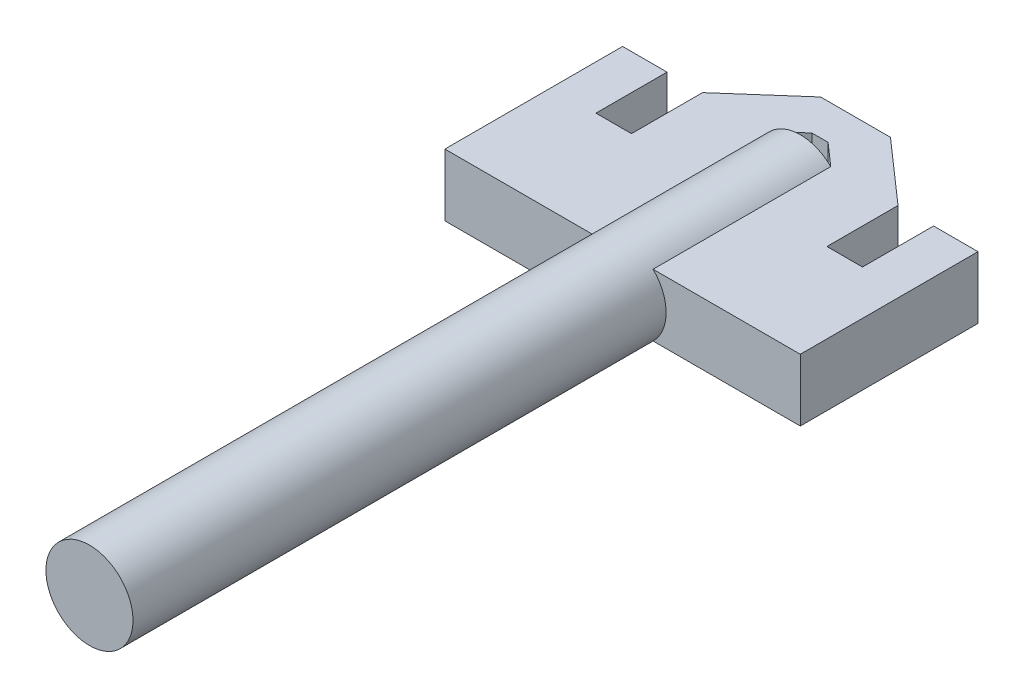
ISO-10303-21;
HEADER;
FILE_DESCRIPTION(('STEP AP214'),'2;1');
FILE_NAME('part.step','',(''),(''),'','','');
FILE_SCHEMA(('AUTOMOTIVE_DESIGN { 1 0 10303 214 1 1 1 1 }'));
ENDSEC;
DATA;
#1=APPLICATION_CONTEXT('core data for automotive mechanical design processes');
#2=APPLICATION_PROTOCOL_DEFINITION('international standard','automotive_design',2000,#1);
#3=PRODUCT_CONTEXT('',#1,'mechanical');
#4=PRODUCT('Part','Part','',(#3));
#5=PRODUCT_RELATED_PRODUCT_CATEGORY('part','',(#4));
#6=PRODUCT_DEFINITION_FORMATION('','',#4);
#7=PRODUCT_DEFINITION_CONTEXT('part definition',#1,'design');
#8=PRODUCT_DEFINITION('design','',#6,#7);
#9=PRODUCT_DEFINITION_SHAPE('','',#8);
#10=(LENGTH_UNIT() NAMED_UNIT(*) SI_UNIT(.MILLI.,.METRE.));
#11=(NAMED_UNIT(*) PLANE_ANGLE_UNIT() SI_UNIT($,.RADIAN.));
#12=(NAMED_UNIT(*) SI_UNIT($,.STERADIAN.) SOLID_ANGLE_UNIT());
#13=UNCERTAINTY_MEASURE_WITH_UNIT(LENGTH_MEASURE(1.E-05),#10,'distance_accuracy_value','');
#14=(GEOMETRIC_REPRESENTATION_CONTEXT(3) GLOBAL_UNCERTAINTY_ASSIGNED_CONTEXT((#13)) GLOBAL_UNIT_ASSIGNED_CONTEXT((#10,
#11,#12)) REPRESENTATION_CONTEXT('',''));
#15=CARTESIAN_POINT('',(0.,0.,0.));
#16=DIRECTION('',(0.,0.,1.));
#17=DIRECTION('',(1.,0.,0.));
#18=AXIS2_PLACEMENT_3D('',#15,#16,#17);
#19=CARTESIAN_POINT('',(0.,0.,0.));
#20=DIRECTION('',(0.,0.,1.));
#21=DIRECTION('',(1.,0.,0.));
#22=AXIS2_PLACEMENT_3D('',#19,#20,#21);
#23=PLANE('',#22);
#24=DIRECTION('',(0.,-1.,0.));
#25=VECTOR('',#24,1.);
#26=CARTESIAN_POINT('',(-1.71464281994822,13.1809856193247,0.));
#27=LINE('',#26,#25);
#28=CARTESIAN_POINT('',(-1.71464281994822,1.75,0.));
#29=VERTEX_POINT('',#28);
#30=CARTESIAN_POINT('',(-1.71464281994822,-1.75,0.));
#31=VERTEX_POINT('',#30);
#32=EDGE_CURVE('E197',#29,#31,#27,.T.);
#33=ORIENTED_EDGE('',*,*,#32,.F.);
#34=CARTESIAN_POINT('',(0.,0.,0.));
#35=DIRECTION('',(0.,0.,1.));
#36=DIRECTION('',(1.,0.,0.));
#37=AXIS2_PLACEMENT_3D('',#34,#35,#36);
#38=CIRCLE('',#37,2.45);
#39=CARTESIAN_POINT('',(1.71464281994822,1.75,0.));
#40=VERTEX_POINT('',#39);
#41=EDGE_CURVE('E400',#40,#29,#38,.T.);
#42=ORIENTED_EDGE('',*,*,#41,.F.);
#43=DIRECTION('',(0.,-1.,0.));
#44=VECTOR('',#43,1.);
#45=CARTESIAN_POINT('',(1.71464281994822,13.1809856193247,0.));
#46=LINE('',#45,#44);
#47=CARTESIAN_POINT('',(1.71464281994822,-1.75,0.));
#48=VERTEX_POINT('',#47);
#49=EDGE_CURVE('E256',#40,#48,#46,.T.);
#50=ORIENTED_EDGE('',*,*,#49,.T.);
#51=EDGE_CURVE('E396',#31,#48,#38,.T.);
#52=ORIENTED_EDGE('',*,*,#51,.F.);
#53=EDGE_LOOP('',(#33,#42,#50,#52));
#54=FACE_BOUND('',#53,.T.);
#55=ADVANCED_FACE('F45',(#54),#23,.F.);
#56=DIRECTION('',(1.,0.,0.));
#57=VECTOR('',#56,1.);
#58=CARTESIAN_POINT('',(10.,1.75,0.));
#59=LINE('',#58,#57);
#60=CARTESIAN_POINT('',(-10.,1.75,0.));
#61=VERTEX_POINT('',#60);
#62=CARTESIAN_POINT('',(-7.5,1.75,0.));
#63=VERTEX_POINT('',#62);
#64=EDGE_CURVE('E338',#61,#63,#59,.T.);
#65=ORIENTED_EDGE('',*,*,#64,.T.);
#66=DIRECTION('',(0.,1.,0.));
#67=VECTOR('',#66,1.);
#68=CARTESIAN_POINT('',(-7.5,1.75,0.));
#69=LINE('',#68,#67);
#70=CARTESIAN_POINT('',(-7.5,-1.75,0.));
#71=VERTEX_POINT('',#70);
#72=EDGE_CURVE('E283',#71,#63,#69,.T.);
#73=ORIENTED_EDGE('',*,*,#72,.F.);
#74=DIRECTION('',(-1.,0.,0.));
#75=VECTOR('',#74,1.);
#76=CARTESIAN_POINT('',(10.,-1.75,0.));
#77=LINE('',#76,#75);
#78=CARTESIAN_POINT('',(-10.,-1.75,0.));
#79=VERTEX_POINT('',#78);
#80=EDGE_CURVE('E356',#71,#79,#77,.T.);
#81=ORIENTED_EDGE('',*,*,#80,.T.);
#82=DIRECTION('',(0.,1.,0.));
#83=VECTOR('',#82,1.);
#84=CARTESIAN_POINT('',(-10.,1.75,0.));
#85=LINE('',#84,#83);
#86=EDGE_CURVE('E361',#79,#61,#85,.T.);
#87=ORIENTED_EDGE('',*,*,#86,.T.);
#88=EDGE_LOOP('',(#65,#73,#81,#87));
#89=FACE_BOUND('',#88,.T.);
#90=ADVANCED_FACE('F432',(#89),#23,.F.);
#91=CARTESIAN_POINT('',(0.,0.,40.));
#92=DIRECTION('',(0.,0.,-1.));
#93=DIRECTION('',(-1.,0.,0.));
#94=AXIS2_PLACEMENT_3D('',#91,#92,#93);
#95=CYLINDRICAL_SURFACE('',#94,2.45);
#96=CARTESIAN_POINT('',(0.,0.,10.));
#97=DIRECTION('',(0.,0.,-1.));
#98=DIRECTION('',(-1.,0.,0.));
#99=AXIS2_PLACEMENT_3D('',#96,#97,#98);
#100=CIRCLE('',#99,2.45);
#101=CARTESIAN_POINT('',(1.71464281994822,1.75,10.));
#102=VERTEX_POINT('',#101);
#103=CARTESIAN_POINT('',(1.71464281994822,-1.75,10.));
#104=VERTEX_POINT('',#103);
#105=EDGE_CURVE('E11',#102,#104,#100,.T.);
#106=ORIENTED_EDGE('',*,*,#105,.F.);
#107=DIRECTION('',(0.,0.,-1.));
#108=VECTOR('',#107,1.);
#109=CARTESIAN_POINT('',(1.71464281994822,1.75,40.));
#110=LINE('',#109,#108);
#111=EDGE_CURVE('E392',#102,#40,#110,.T.);
#112=ORIENTED_EDGE('',*,*,#111,.T.);
#113=ORIENTED_EDGE('',*,*,#41,.T.);
#114=DIRECTION('',(0.,0.,-1.));
#115=VECTOR('',#114,1.);
#116=CARTESIAN_POINT('',(-1.71464281994822,1.75,40.));
#117=LINE('',#116,#115);
#118=CARTESIAN_POINT('',(-1.71464281994822,1.75,10.));
#119=VERTEX_POINT('',#118);
#120=EDGE_CURVE('E389',#29,#119,#117,.F.);
#121=ORIENTED_EDGE('',*,*,#120,.T.);
#122=CARTESIAN_POINT('',(-1.71464281994822,-1.75,10.));
#123=VERTEX_POINT('',#122);
#124=EDGE_CURVE('E49',#123,#119,#100,.T.);
#125=ORIENTED_EDGE('',*,*,#124,.F.);
#126=DIRECTION('',(0.,0.,-1.));
#127=VECTOR('',#126,1.);
#128=CARTESIAN_POINT('',(-1.71464281994822,-1.75,40.));
#129=LINE('',#128,#127);
#130=EDGE_CURVE('E385',#123,#31,#129,.T.);
#131=ORIENTED_EDGE('',*,*,#130,.T.);
#132=ORIENTED_EDGE('',*,*,#51,.T.);
#133=DIRECTION('',(0.,0.,-1.));
#134=VECTOR('',#133,1.);
#135=CARTESIAN_POINT('',(1.71464281994822,-1.75,40.));
#136=LINE('',#135,#134);
#137=EDGE_CURVE('E373',#48,#104,#136,.F.);
#138=ORIENTED_EDGE('',*,*,#137,.T.);
#139=EDGE_LOOP('',(#106,#112,#113,#121,#125,#131,#132,#138));
#140=FACE_BOUND('',#139,.T.);
#141=CARTESIAN_POINT('',(0.,0.,40.));
#142=DIRECTION('',(0.,0.,1.));
#143=DIRECTION('',(1.,0.,0.));
#144=AXIS2_PLACEMENT_3D('',#141,#142,#143);
#145=CIRCLE('',#144,2.45);
#146=CARTESIAN_POINT('',(2.45,0.,40.));
#147=VERTEX_POINT('',#146);
#148=EDGE_CURVE('E397',#147,#147,#145,.T.);
#149=ORIENTED_EDGE('',*,*,#148,.F.);
#150=EDGE_LOOP('',(#149));
#151=FACE_BOUND('',#150,.T.);
#152=ADVANCED_FACE('F47',(#140,#151),#95,.T.);
#153=CARTESIAN_POINT('',(0.,0.,40.));
#154=DIRECTION('',(0.,0.,1.));
#155=DIRECTION('',(1.,0.,0.));
#156=AXIS2_PLACEMENT_3D('',#153,#154,#155);
#157=PLANE('',#156);
#158=ORIENTED_EDGE('',*,*,#148,.T.);
#159=EDGE_LOOP('',(#158));
#160=FACE_BOUND('',#159,.T.);
#161=ADVANCED_FACE('F485',(#160),#157,.T.);
#162=CARTESIAN_POINT('',(10.,-1.75,0.));
#163=VERTEX_POINT('',#162);
#164=CARTESIAN_POINT('',(7.5,-1.75,0.));
#165=VERTEX_POINT('',#164);
#166=EDGE_CURVE('E357',#163,#165,#77,.T.);
#167=ORIENTED_EDGE('',*,*,#166,.T.);
#168=DIRECTION('',(0.,-1.,0.));
#169=VECTOR('',#168,1.);
#170=CARTESIAN_POINT('',(7.5,1.75,0.));
#171=LINE('',#170,#169);
#172=CARTESIAN_POINT('',(7.5,1.75,0.));
#173=VERTEX_POINT('',#172);
#174=EDGE_CURVE('E270',#173,#165,#171,.T.);
#175=ORIENTED_EDGE('',*,*,#174,.F.);
#176=CARTESIAN_POINT('',(10.,1.75,0.));
#177=VERTEX_POINT('',#176);
#178=EDGE_CURVE('E365',#173,#177,#59,.T.);
#179=ORIENTED_EDGE('',*,*,#178,.T.);
#180=DIRECTION('',(0.,-1.,0.));
#181=VECTOR('',#180,1.);
#182=CARTESIAN_POINT('',(10.,1.75,0.));
#183=LINE('',#182,#181);
#184=EDGE_CURVE('E290',#177,#163,#183,.T.);
#185=ORIENTED_EDGE('',*,*,#184,.T.);
#186=EDGE_LOOP('',(#167,#175,#179,#185));
#187=FACE_BOUND('',#186,.T.);
#188=ADVANCED_FACE('F469',(#187),#23,.F.);
#189=CARTESIAN_POINT('',(-10.,1.75,10.));
#190=DIRECTION('',(-1.,0.,0.));
#191=DIRECTION('',(0.,0.,1.));
#192=AXIS2_PLACEMENT_3D('',#189,#190,#191);
#193=PLANE('',#192);
#194=ORIENTED_EDGE('',*,*,#86,.F.);
#195=DIRECTION('',(0.,0.,-1.));
#196=VECTOR('',#195,1.);
#197=CARTESIAN_POINT('',(-10.,-1.75,10.));
#198=LINE('',#197,#196);
#199=CARTESIAN_POINT('',(-10.,-1.75,10.));
#200=VERTEX_POINT('',#199);
#201=EDGE_CURVE('E377',#200,#79,#198,.T.);
#202=ORIENTED_EDGE('',*,*,#201,.F.);
#203=DIRECTION('',(0.,1.,0.));
#204=VECTOR('',#203,1.);
#205=CARTESIAN_POINT('',(-10.,1.75,10.));
#206=LINE('',#205,#204);
#207=CARTESIAN_POINT('',(-10.,1.75,10.));
#208=VERTEX_POINT('',#207);
#209=EDGE_CURVE('E343',#200,#208,#206,.T.);
#210=ORIENTED_EDGE('',*,*,#209,.T.);
#211=DIRECTION('',(0.,0.,-1.));
#212=VECTOR('',#211,1.);
#213=CARTESIAN_POINT('',(-10.,1.75,10.));
#214=LINE('',#213,#212);
#215=EDGE_CURVE('E374',#208,#61,#214,.T.);
#216=ORIENTED_EDGE('',*,*,#215,.T.);
#217=EDGE_LOOP('',(#194,#202,#210,#216));
#218=FACE_BOUND('',#217,.T.);
#219=ADVANCED_FACE('F439',(#218),#193,.T.);
#220=CARTESIAN_POINT('',(0.,0.,10.));
#221=DIRECTION('',(0.,0.,-1.));
#222=DIRECTION('',(-1.,0.,0.));
#223=AXIS2_PLACEMENT_3D('',#220,#221,#222);
#224=PLANE('',#223);
#225=DIRECTION('',(-1.,0.,0.));
#226=VECTOR('',#225,1.);
#227=CARTESIAN_POINT('',(10.,-1.75,10.));
#228=LINE('',#227,#226);
#229=EDGE_CURVE('E337',#123,#200,#228,.T.);
#230=ORIENTED_EDGE('',*,*,#229,.F.);
#231=ORIENTED_EDGE('',*,*,#124,.T.);
#232=DIRECTION('',(1.,0.,0.));
#233=VECTOR('',#232,1.);
#234=CARTESIAN_POINT('',(10.,1.75,10.));
#235=LINE('',#234,#233);
#236=EDGE_CURVE('E348',#208,#119,#235,.T.);
#237=ORIENTED_EDGE('',*,*,#236,.F.);
#238=ORIENTED_EDGE('',*,*,#209,.F.);
#239=EDGE_LOOP('',(#230,#231,#237,#238));
#240=FACE_BOUND('',#239,.T.);
#241=ADVANCED_FACE('F490',(#240),#224,.F.);
#242=CARTESIAN_POINT('',(10.,-1.75,10.));
#243=DIRECTION('',(0.,-1.,0.));
#244=DIRECTION('',(0.,0.,-1.));
#245=AXIS2_PLACEMENT_3D('',#242,#243,#244);
#246=PLANE('',#245);
#247=DIRECTION('',(0.,0.,-1.));
#248=VECTOR('',#247,1.);
#249=CARTESIAN_POINT('',(-7.5,-1.75,4.));
#250=LINE('',#249,#248);
#251=CARTESIAN_POINT('',(-7.5,-1.75,4.));
#252=VERTEX_POINT('',#251);
#253=EDGE_CURVE('E233',#252,#71,#250,.T.);
#254=ORIENTED_EDGE('',*,*,#253,.F.);
#255=DIRECTION('',(-1.,0.,0.));
#256=VECTOR('',#255,1.);
#257=CARTESIAN_POINT('',(-7.5,-1.75,4.));
#258=LINE('',#257,#256);
#259=CARTESIAN_POINT('',(-5.5,-1.75,4.));
#260=VERTEX_POINT('',#259);
#261=EDGE_CURVE('E305',#260,#252,#258,.T.);
#262=ORIENTED_EDGE('',*,*,#261,.F.);
#263=DIRECTION('',(0.,0.,-1.));
#264=VECTOR('',#263,1.);
#265=CARTESIAN_POINT('',(-5.5,-1.75,4.));
#266=LINE('',#265,#264);
#267=CARTESIAN_POINT('',(-5.5,-1.75,0.));
#268=VERTEX_POINT('',#267);
#269=EDGE_CURVE('E310',#260,#268,#266,.T.);
#270=ORIENTED_EDGE('',*,*,#269,.T.);
#271=DIRECTION('',(-0.750879123847372,0.,0.660439657629826));
#272=VECTOR('',#271,1.);
#273=CARTESIAN_POINT('',(-5.5,-1.75,0.));
#274=LINE('',#273,#272);
#275=CARTESIAN_POINT('',(-1.96497528372468,-1.75,-3.10924946397152));
#276=VERTEX_POINT('',#275);
#277=EDGE_CURVE('E216',#276,#268,#274,.T.);
#278=ORIENTED_EDGE('',*,*,#277,.F.);
#279=DIRECTION('',(-1.,0.,0.));
#280=VECTOR('',#279,1.);
#281=CARTESIAN_POINT('',(-1.96497528372468,-1.75,-3.10924946397152));
#282=LINE('',#281,#280);
#283=CARTESIAN_POINT('',(1.96497528372468,-1.75,-3.10924946397152));
#284=VERTEX_POINT('',#283);
#285=EDGE_CURVE('E219',#284,#276,#282,.T.);
#286=ORIENTED_EDGE('',*,*,#285,.F.);
#287=DIRECTION('',(-0.750879123847373,0.,-0.660439657629826));
#288=VECTOR('',#287,1.);
#289=CARTESIAN_POINT('',(1.96497528372468,-1.75,-3.10924946397152));
#290=LINE('',#289,#288);
#291=CARTESIAN_POINT('',(5.5,-1.75,0.));
#292=VERTEX_POINT('',#291);
#293=EDGE_CURVE('E223',#292,#284,#290,.T.);
#294=ORIENTED_EDGE('',*,*,#293,.F.);
#295=DIRECTION('',(0.,0.,-1.));
#296=VECTOR('',#295,1.);
#297=CARTESIAN_POINT('',(5.5,-1.75,4.));
#298=LINE('',#297,#296);
#299=CARTESIAN_POINT('',(5.5,-1.75,4.));
#300=VERTEX_POINT('',#299);
#301=EDGE_CURVE('E286',#300,#292,#298,.T.);
#302=ORIENTED_EDGE('',*,*,#301,.F.);
#303=DIRECTION('',(-1.,0.,0.));
#304=VECTOR('',#303,1.);
#305=CARTESIAN_POINT('',(7.5,-1.75,4.));
#306=LINE('',#305,#304);
#307=CARTESIAN_POINT('',(7.5,-1.75,4.));
#308=VERTEX_POINT('',#307);
#309=EDGE_CURVE('E275',#308,#300,#306,.T.);
#310=ORIENTED_EDGE('',*,*,#309,.F.);
#311=DIRECTION('',(0.,0.,-1.));
#312=VECTOR('',#311,1.);
#313=CARTESIAN_POINT('',(7.5,-1.75,4.));
#314=LINE('',#313,#312);
#315=EDGE_CURVE('E291',#308,#165,#314,.T.);
#316=ORIENTED_EDGE('',*,*,#315,.T.);
#317=ORIENTED_EDGE('',*,*,#166,.F.);
#318=DIRECTION('',(0.,0.,-1.));
#319=VECTOR('',#318,1.);
#320=CARTESIAN_POINT('',(10.,-1.75,10.));
#321=LINE('',#320,#319);
#322=CARTESIAN_POINT('',(10.,-1.75,10.));
#323=VERTEX_POINT('',#322);
#324=EDGE_CURVE('E352',#323,#163,#321,.T.);
#325=ORIENTED_EDGE('',*,*,#324,.F.);
#326=EDGE_CURVE('E339',#323,#104,#228,.T.);
#327=ORIENTED_EDGE('',*,*,#326,.T.);
#328=ORIENTED_EDGE('',*,*,#137,.F.);
#329=DIRECTION('',(0.750879123847373,0.,0.660439657629826));
#330=VECTOR('',#329,1.);
#331=CARTESIAN_POINT('',(0.453494649918216,-1.75,-1.10924946397152));
#332=LINE('',#331,#330);
#333=CARTESIAN_POINT('',(0.453494649918216,-1.75,-1.10924946397152));
#334=VERTEX_POINT('',#333);
#335=EDGE_CURVE('E208',#334,#48,#332,.T.);
#336=ORIENTED_EDGE('',*,*,#335,.F.);
#337=DIRECTION('',(1.,0.,0.));
#338=VECTOR('',#337,1.);
#339=CARTESIAN_POINT('',(-0.453494649918216,-1.75,-1.10924946397152));
#340=LINE('',#339,#338);
#341=CARTESIAN_POINT('',(-0.453494649918216,-1.75,-1.10924946397152));
#342=VERTEX_POINT('',#341);
#343=EDGE_CURVE('E189',#342,#334,#340,.T.);
#344=ORIENTED_EDGE('',*,*,#343,.F.);
#345=DIRECTION('',(0.750879123847373,0.,-0.660439657629826));
#346=VECTOR('',#345,1.);
#347=CARTESIAN_POINT('',(-1.71464281994822,-1.75,0.));
#348=LINE('',#347,#346);
#349=EDGE_CURVE('E205',#31,#342,#348,.T.);
#350=ORIENTED_EDGE('',*,*,#349,.F.);
#351=ORIENTED_EDGE('',*,*,#130,.F.);
#352=ORIENTED_EDGE('',*,*,#229,.T.);
#353=ORIENTED_EDGE('',*,*,#201,.T.);
#354=ORIENTED_EDGE('',*,*,#80,.F.);
#355=EDGE_LOOP('',(#254,#262,#270,#278,#286,#294,#302,#310,#316,#317,#325,#327,#328,#336,#344,
#350,#351,#352,#353,#354));
#356=FACE_BOUND('',#355,.T.);
#357=ADVANCED_FACE('F203',(#356),#246,.T.);
#358=CARTESIAN_POINT('',(10.,1.75,10.));
#359=VERTEX_POINT('',#358);
#360=EDGE_CURVE('E347',#102,#359,#235,.T.);
#361=ORIENTED_EDGE('',*,*,#360,.F.);
#362=ORIENTED_EDGE('',*,*,#105,.T.);
#363=ORIENTED_EDGE('',*,*,#326,.F.);
#364=DIRECTION('',(0.,-1.,0.));
#365=VECTOR('',#364,1.);
#366=CARTESIAN_POINT('',(10.,1.75,10.));
#367=LINE('',#366,#365);
#368=EDGE_CURVE('E333',#359,#323,#367,.T.);
#369=ORIENTED_EDGE('',*,*,#368,.F.);
#370=EDGE_LOOP('',(#361,#362,#363,#369));
#371=FACE_BOUND('',#370,.T.);
#372=ADVANCED_FACE('F415',(#371),#224,.F.);
#373=CARTESIAN_POINT('',(10.,1.75,10.));
#374=DIRECTION('',(0.,1.,0.));
#375=DIRECTION('',(0.,0.,1.));
#376=AXIS2_PLACEMENT_3D('',#373,#374,#375);
#377=PLANE('',#376);
#378=DIRECTION('',(0.,0.,-1.));
#379=VECTOR('',#378,1.);
#380=CARTESIAN_POINT('',(5.5,1.75,4.));
#381=LINE('',#380,#379);
#382=CARTESIAN_POINT('',(5.5,1.75,4.));
#383=VERTEX_POINT('',#382);
#384=CARTESIAN_POINT('',(5.5,1.75,0.));
#385=VERTEX_POINT('',#384);
#386=EDGE_CURVE('E278',#383,#385,#381,.T.);
#387=ORIENTED_EDGE('',*,*,#386,.T.);
#388=DIRECTION('',(-0.750879123847373,0.,-0.660439657629826));
#389=VECTOR('',#388,1.);
#390=CARTESIAN_POINT('',(1.96497528372468,1.75,-3.10924946397152));
#391=LINE('',#390,#389);
#392=CARTESIAN_POINT('',(1.96497528372468,1.75,-3.10924946397152));
#393=VERTEX_POINT('',#392);
#394=EDGE_CURVE('E234',#385,#393,#391,.T.);
#395=ORIENTED_EDGE('',*,*,#394,.T.);
#396=DIRECTION('',(-1.,0.,0.));
#397=VECTOR('',#396,1.);
#398=CARTESIAN_POINT('',(-1.96497528372468,1.75,-3.10924946397152));
#399=LINE('',#398,#397);
#400=CARTESIAN_POINT('',(-1.96497528372468,1.75,-3.10924946397152));
#401=VERTEX_POINT('',#400);
#402=EDGE_CURVE('E229',#393,#401,#399,.T.);
#403=ORIENTED_EDGE('',*,*,#402,.T.);
#404=DIRECTION('',(-0.750879123847372,0.,0.660439657629826));
#405=VECTOR('',#404,1.);
#406=CARTESIAN_POINT('',(-5.5,1.75,0.));
#407=LINE('',#406,#405);
#408=CARTESIAN_POINT('',(-5.5,1.75,0.));
#409=VERTEX_POINT('',#408);
#410=EDGE_CURVE('E247',#401,#409,#407,.T.);
#411=ORIENTED_EDGE('',*,*,#410,.T.);
#412=DIRECTION('',(0.,0.,-1.));
#413=VECTOR('',#412,1.);
#414=CARTESIAN_POINT('',(-5.5,1.75,4.));
#415=LINE('',#414,#413);
#416=CARTESIAN_POINT('',(-5.5,1.75,4.));
#417=VERTEX_POINT('',#416);
#418=EDGE_CURVE('E306',#417,#409,#415,.T.);
#419=ORIENTED_EDGE('',*,*,#418,.F.);
#420=DIRECTION('',(1.,0.,0.));
#421=VECTOR('',#420,1.);
#422=CARTESIAN_POINT('',(-7.5,1.75,4.));
#423=LINE('',#422,#421);
#424=CARTESIAN_POINT('',(-7.5,1.75,4.));
#425=VERTEX_POINT('',#424);
#426=EDGE_CURVE('E328',#425,#417,#423,.T.);
#427=ORIENTED_EDGE('',*,*,#426,.F.);
#428=DIRECTION('',(0.,0.,-1.));
#429=VECTOR('',#428,1.);
#430=CARTESIAN_POINT('',(-7.5,1.75,4.));
#431=LINE('',#430,#429);
#432=EDGE_CURVE('E301',#425,#63,#431,.T.);
#433=ORIENTED_EDGE('',*,*,#432,.T.);
#434=ORIENTED_EDGE('',*,*,#64,.F.);
#435=ORIENTED_EDGE('',*,*,#215,.F.);
#436=ORIENTED_EDGE('',*,*,#236,.T.);
#437=ORIENTED_EDGE('',*,*,#120,.F.);
#438=DIRECTION('',(0.750879123847373,0.,-0.660439657629826));
#439=VECTOR('',#438,1.);
#440=CARTESIAN_POINT('',(-1.71464281994822,1.75,0.));
#441=LINE('',#440,#439);
#442=CARTESIAN_POINT('',(-0.453494649918216,1.75,-1.10924946397152));
#443=VERTEX_POINT('',#442);
#444=EDGE_CURVE('E244',#29,#443,#441,.T.);
#445=ORIENTED_EDGE('',*,*,#444,.T.);
#446=DIRECTION('',(1.,0.,0.));
#447=VECTOR('',#446,1.);
#448=CARTESIAN_POINT('',(-0.453494649918216,1.75,-1.10924946397152));
#449=LINE('',#448,#447);
#450=CARTESIAN_POINT('',(0.453494649918216,1.75,-1.10924946397152));
#451=VERTEX_POINT('',#450);
#452=EDGE_CURVE('E191',#443,#451,#449,.T.);
#453=ORIENTED_EDGE('',*,*,#452,.T.);
#454=DIRECTION('',(0.750879123847373,0.,0.660439657629826));
#455=VECTOR('',#454,1.);
#456=CARTESIAN_POINT('',(0.453494649918216,1.75,-1.10924946397152));
#457=LINE('',#456,#455);
#458=EDGE_CURVE('E238',#451,#40,#457,.T.);
#459=ORIENTED_EDGE('',*,*,#458,.T.);
#460=ORIENTED_EDGE('',*,*,#111,.F.);
#461=ORIENTED_EDGE('',*,*,#360,.T.);
#462=DIRECTION('',(0.,0.,-1.));
#463=VECTOR('',#462,1.);
#464=CARTESIAN_POINT('',(10.,1.75,10.));
#465=LINE('',#464,#463);
#466=EDGE_CURVE('E369',#359,#177,#465,.T.);
#467=ORIENTED_EDGE('',*,*,#466,.T.);
#468=ORIENTED_EDGE('',*,*,#178,.F.);
#469=DIRECTION('',(0.,0.,-1.));
#470=VECTOR('',#469,1.);
#471=CARTESIAN_POINT('',(7.5,1.75,4.));
#472=LINE('',#471,#470);
#473=CARTESIAN_POINT('',(7.5,1.75,4.));
#474=VERTEX_POINT('',#473);
#475=EDGE_CURVE('E295',#474,#173,#472,.T.);
#476=ORIENTED_EDGE('',*,*,#475,.F.);
#477=DIRECTION('',(1.,0.,0.));
#478=VECTOR('',#477,1.);
#479=CARTESIAN_POINT('',(7.5,1.75,4.));
#480=LINE('',#479,#478);
#481=EDGE_CURVE('E269',#383,#474,#480,.T.);
#482=ORIENTED_EDGE('',*,*,#481,.F.);
#483=EDGE_LOOP('',(#387,#395,#403,#411,#419,#427,#433,#434,#435,#436,#437,#445,#453,#459,#460,
#461,#467,#468,#476,#482));
#484=FACE_BOUND('',#483,.T.);
#485=ADVANCED_FACE('F422',(#484),#377,.T.);
#486=CARTESIAN_POINT('',(10.,1.75,10.));
#487=DIRECTION('',(1.,0.,0.));
#488=DIRECTION('',(0.,0.,-1.));
#489=AXIS2_PLACEMENT_3D('',#486,#487,#488);
#490=PLANE('',#489);
#491=ORIENTED_EDGE('',*,*,#184,.F.);
#492=ORIENTED_EDGE('',*,*,#466,.F.);
#493=ORIENTED_EDGE('',*,*,#368,.T.);
#494=ORIENTED_EDGE('',*,*,#324,.T.);
#495=EDGE_LOOP('',(#491,#492,#493,#494));
#496=FACE_BOUND('',#495,.T.);
#497=ADVANCED_FACE('F419',(#496),#490,.T.);
#498=CARTESIAN_POINT('',(5.5,1.75,4.));
#499=DIRECTION('',(-1.,0.,0.));
#500=DIRECTION('',(0.,0.,1.));
#501=AXIS2_PLACEMENT_3D('',#498,#499,#500);
#502=PLANE('',#501);
#503=DIRECTION('',(0.,1.,0.));
#504=VECTOR('',#503,1.);
#505=CARTESIAN_POINT('',(5.5,1.75,0.));
#506=LINE('',#505,#504);
#507=EDGE_CURVE('E279',#292,#385,#506,.T.);
#508=ORIENTED_EDGE('',*,*,#507,.T.);
#509=ORIENTED_EDGE('',*,*,#386,.F.);
#510=DIRECTION('',(0.,1.,0.));
#511=VECTOR('',#510,1.);
#512=CARTESIAN_POINT('',(5.5,1.75,4.));
#513=LINE('',#512,#511);
#514=EDGE_CURVE('E265',#300,#383,#513,.T.);
#515=ORIENTED_EDGE('',*,*,#514,.F.);
#516=ORIENTED_EDGE('',*,*,#301,.T.);
#517=EDGE_LOOP('',(#508,#509,#515,#516));
#518=FACE_BOUND('',#517,.T.);
#519=ADVANCED_FACE('F463',(#518),#502,.F.);
#520=CARTESIAN_POINT('',(7.5,1.75,4.));
#521=DIRECTION('',(1.,0.,0.));
#522=DIRECTION('',(0.,0.,-1.));
#523=AXIS2_PLACEMENT_3D('',#520,#521,#522);
#524=PLANE('',#523);
#525=ORIENTED_EDGE('',*,*,#174,.T.);
#526=ORIENTED_EDGE('',*,*,#315,.F.);
#527=DIRECTION('',(0.,-1.,0.));
#528=VECTOR('',#527,1.);
#529=CARTESIAN_POINT('',(7.5,1.75,4.));
#530=LINE('',#529,#528);
#531=EDGE_CURVE('E69',#474,#308,#530,.T.);
#532=ORIENTED_EDGE('',*,*,#531,.F.);
#533=ORIENTED_EDGE('',*,*,#475,.T.);
#534=EDGE_LOOP('',(#525,#526,#532,#533));
#535=FACE_BOUND('',#534,.T.);
#536=ADVANCED_FACE('F470',(#535),#524,.F.);
#537=CARTESIAN_POINT('',(0.,0.,4.));
#538=DIRECTION('',(0.,0.,-1.));
#539=DIRECTION('',(-1.,0.,0.));
#540=AXIS2_PLACEMENT_3D('',#537,#538,#539);
#541=PLANE('',#540);
#542=ORIENTED_EDGE('',*,*,#514,.T.);
#543=ORIENTED_EDGE('',*,*,#481,.T.);
#544=ORIENTED_EDGE('',*,*,#531,.T.);
#545=ORIENTED_EDGE('',*,*,#309,.T.);
#546=EDGE_LOOP('',(#542,#543,#544,#545));
#547=FACE_BOUND('',#546,.T.);
#548=ADVANCED_FACE('F465',(#547),#541,.T.);
#549=CARTESIAN_POINT('',(-7.5,1.75,4.));
#550=DIRECTION('',(-1.,0.,0.));
#551=DIRECTION('',(0.,-1.,0.));
#552=AXIS2_PLACEMENT_3D('',#549,#550,#551);
#553=PLANE('',#552);
#554=ORIENTED_EDGE('',*,*,#72,.T.);
#555=ORIENTED_EDGE('',*,*,#432,.F.);
#556=DIRECTION('',(0.,1.,0.));
#557=VECTOR('',#556,1.);
#558=CARTESIAN_POINT('',(-7.5,1.75,4.));
#559=LINE('',#558,#557);
#560=EDGE_CURVE('E61',#252,#425,#559,.T.);
#561=ORIENTED_EDGE('',*,*,#560,.F.);
#562=ORIENTED_EDGE('',*,*,#253,.T.);
#563=EDGE_LOOP('',(#554,#555,#561,#562));
#564=FACE_BOUND('',#563,.T.);
#565=ADVANCED_FACE('F444',(#564),#553,.F.);
#566=CARTESIAN_POINT('',(-5.5,1.75,4.));
#567=DIRECTION('',(1.,0.,0.));
#568=DIRECTION('',(0.,1.,0.));
#569=AXIS2_PLACEMENT_3D('',#566,#567,#568);
#570=PLANE('',#569);
#571=DIRECTION('',(0.,-1.,0.));
#572=VECTOR('',#571,1.);
#573=CARTESIAN_POINT('',(-5.5,1.75,0.));
#574=LINE('',#573,#572);
#575=EDGE_CURVE('E316',#409,#268,#574,.T.);
#576=ORIENTED_EDGE('',*,*,#575,.T.);
#577=ORIENTED_EDGE('',*,*,#269,.F.);
#578=DIRECTION('',(0.,-1.,0.));
#579=VECTOR('',#578,1.);
#580=CARTESIAN_POINT('',(-5.5,1.75,4.));
#581=LINE('',#580,#579);
#582=EDGE_CURVE('E324',#417,#260,#581,.T.);
#583=ORIENTED_EDGE('',*,*,#582,.F.);
#584=ORIENTED_EDGE('',*,*,#418,.T.);
#585=EDGE_LOOP('',(#576,#577,#583,#584));
#586=FACE_BOUND('',#585,.T.);
#587=ADVANCED_FACE('F449',(#586),#570,.F.);
#588=CARTESIAN_POINT('',(0.,0.,4.));
#589=DIRECTION('',(0.,0.,1.));
#590=DIRECTION('',(1.,0.,0.));
#591=AXIS2_PLACEMENT_3D('',#588,#589,#590);
#592=PLANE('',#591);
#593=ORIENTED_EDGE('',*,*,#560,.T.);
#594=ORIENTED_EDGE('',*,*,#426,.T.);
#595=ORIENTED_EDGE('',*,*,#582,.T.);
#596=ORIENTED_EDGE('',*,*,#261,.T.);
#597=EDGE_LOOP('',(#593,#594,#595,#596));
#598=FACE_BOUND('',#597,.T.);
#599=ADVANCED_FACE('F447',(#598),#592,.F.);
#600=CARTESIAN_POINT('',(-1.71464281994822,13.1809856193247,0.));
#601=DIRECTION('',(-0.660439657629826,0.,-0.750879123847373));
#602=DIRECTION('',(-0.750879123847373,0.,0.660439657629826));
#603=AXIS2_PLACEMENT_3D('',#600,#601,#602);
#604=PLANE('',#603);
#605=ORIENTED_EDGE('',*,*,#444,.F.);
#606=ORIENTED_EDGE('',*,*,#32,.T.);
#607=ORIENTED_EDGE('',*,*,#349,.T.);
#608=DIRECTION('',(0.,-1.,0.));
#609=VECTOR('',#608,1.);
#610=CARTESIAN_POINT('',(-0.453494649918216,13.1809856193247,-1.10924946397152));
#611=LINE('',#610,#609);
#612=EDGE_CURVE('E185',#443,#342,#611,.T.);
#613=ORIENTED_EDGE('',*,*,#612,.F.);
#614=EDGE_LOOP('',(#605,#606,#607,#613));
#615=FACE_BOUND('',#614,.T.);
#616=ADVANCED_FACE('F211',(#615),#604,.F.);
#617=CARTESIAN_POINT('',(-0.453494649918216,13.1809856193247,-1.10924946397152));
#618=DIRECTION('',(0.,0.,-1.));
#619=DIRECTION('',(-1.,0.,0.));
#620=AXIS2_PLACEMENT_3D('',#617,#618,#619);
#621=PLANE('',#620);
#622=ORIENTED_EDGE('',*,*,#452,.F.);
#623=ORIENTED_EDGE('',*,*,#612,.T.);
#624=ORIENTED_EDGE('',*,*,#343,.T.);
#625=DIRECTION('',(0.,-1.,0.));
#626=VECTOR('',#625,1.);
#627=CARTESIAN_POINT('',(0.453494649918216,13.1809856193247,-1.10924946397152));
#628=LINE('',#627,#626);
#629=EDGE_CURVE('E196',#451,#334,#628,.T.);
#630=ORIENTED_EDGE('',*,*,#629,.F.);
#631=EDGE_LOOP('',(#622,#623,#624,#630));
#632=FACE_BOUND('',#631,.T.);
#633=ADVANCED_FACE('F187',(#632),#621,.F.);
#634=CARTESIAN_POINT('',(0.453494649918216,13.1809856193247,-1.10924946397152));
#635=DIRECTION('',(0.660439657629826,0.,-0.750879123847373));
#636=DIRECTION('',(-0.750879123847373,0.,-0.660439657629826));
#637=AXIS2_PLACEMENT_3D('',#634,#635,#636);
#638=PLANE('',#637);
#639=ORIENTED_EDGE('',*,*,#458,.F.);
#640=ORIENTED_EDGE('',*,*,#629,.T.);
#641=ORIENTED_EDGE('',*,*,#335,.T.);
#642=ORIENTED_EDGE('',*,*,#49,.F.);
#643=EDGE_LOOP('',(#639,#640,#641,#642));
#644=FACE_BOUND('',#643,.T.);
#645=ADVANCED_FACE('F535',(#644),#638,.F.);
#646=CARTESIAN_POINT('',(1.96497528372468,13.1809856193247,-3.10924946397152));
#647=DIRECTION('',(-0.660439657629826,0.,0.750879123847373));
#648=DIRECTION('',(0.750879123847373,0.,0.660439657629826));
#649=AXIS2_PLACEMENT_3D('',#646,#647,#648);
#650=PLANE('',#649);
#651=ORIENTED_EDGE('',*,*,#394,.F.);
#652=ORIENTED_EDGE('',*,*,#507,.F.);
#653=ORIENTED_EDGE('',*,*,#293,.T.);
#654=DIRECTION('',(0.,-1.,0.));
#655=VECTOR('',#654,1.);
#656=CARTESIAN_POINT('',(1.96497528372468,13.1809856193247,-3.10924946397152));
#657=LINE('',#656,#655);
#658=EDGE_CURVE('E260',#393,#284,#657,.T.);
#659=ORIENTED_EDGE('',*,*,#658,.F.);
#660=EDGE_LOOP('',(#651,#652,#653,#659));
#661=FACE_BOUND('',#660,.T.);
#662=ADVANCED_FACE('F458',(#661),#650,.F.);
#663=CARTESIAN_POINT('',(-1.96497528372468,13.1809856193247,-3.10924946397152));
#664=DIRECTION('',(0.,0.,1.));
#665=DIRECTION('',(1.,0.,0.));
#666=AXIS2_PLACEMENT_3D('',#663,#664,#665);
#667=PLANE('',#666);
#668=ORIENTED_EDGE('',*,*,#402,.F.);
#669=ORIENTED_EDGE('',*,*,#658,.T.);
#670=ORIENTED_EDGE('',*,*,#285,.T.);
#671=DIRECTION('',(0.,-1.,0.));
#672=VECTOR('',#671,1.);
#673=CARTESIAN_POINT('',(-1.96497528372468,13.1809856193247,-3.10924946397152));
#674=LINE('',#673,#672);
#675=EDGE_CURVE('E251',#401,#276,#674,.T.);
#676=ORIENTED_EDGE('',*,*,#675,.F.);
#677=EDGE_LOOP('',(#668,#669,#670,#676));
#678=FACE_BOUND('',#677,.T.);
#679=ADVANCED_FACE('F455',(#678),#667,.F.);
#680=CARTESIAN_POINT('',(-5.5,13.1809856193247,0.));
#681=DIRECTION('',(0.660439657629827,0.,0.750879123847373));
#682=DIRECTION('',(0.750879123847372,0.,-0.660439657629826));
#683=AXIS2_PLACEMENT_3D('',#680,#681,#682);
#684=PLANE('',#683);
#685=ORIENTED_EDGE('',*,*,#410,.F.);
#686=ORIENTED_EDGE('',*,*,#675,.T.);
#687=ORIENTED_EDGE('',*,*,#277,.T.);
#688=ORIENTED_EDGE('',*,*,#575,.F.);
#689=EDGE_LOOP('',(#685,#686,#687,#688));
#690=FACE_BOUND('',#689,.T.);
#691=ADVANCED_FACE('F452',(#690),#684,.F.);
#692=CLOSED_SHELL('',(#55,#90,#152,#161,#188,#219,#241,#357,#372,#485,#497,#519,#536,#548,#565,
#587,#599,#616,#633,#645,#662,#679,#691));
#693=MANIFOLD_SOLID_BREP('B2',#692);
#694=ADVANCED_BREP_SHAPE_REPRESENTATION('',(#18,#693),#14);
#695=SHAPE_DEFINITION_REPRESENTATION(#9,#694);
ENDSEC;
END-ISO-10303-21;
